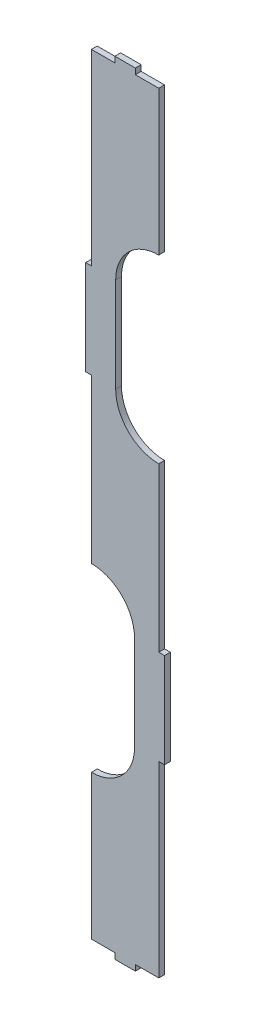
ISO-10303-21;
HEADER;
FILE_DESCRIPTION(('STEP AP214'),'2;1');
FILE_NAME('part.step','',(''),(''),'','','');
FILE_SCHEMA(('AUTOMOTIVE_DESIGN { 1 0 10303 214 1 1 1 1 }'));
ENDSEC;
DATA;
#1=APPLICATION_CONTEXT('core data for automotive mechanical design processes');
#2=APPLICATION_PROTOCOL_DEFINITION('international standard','automotive_design',2000,#1);
#3=PRODUCT_CONTEXT('',#1,'mechanical');
#4=PRODUCT('Part','Part','',(#3));
#5=PRODUCT_RELATED_PRODUCT_CATEGORY('part','',(#4));
#6=PRODUCT_DEFINITION_FORMATION('','',#4);
#7=PRODUCT_DEFINITION_CONTEXT('part definition',#1,'design');
#8=PRODUCT_DEFINITION('design','',#6,#7);
#9=PRODUCT_DEFINITION_SHAPE('','',#8);
#10=(LENGTH_UNIT() NAMED_UNIT(*) SI_UNIT(.MILLI.,.METRE.));
#11=(NAMED_UNIT(*) PLANE_ANGLE_UNIT() SI_UNIT($,.RADIAN.));
#12=(NAMED_UNIT(*) SI_UNIT($,.STERADIAN.) SOLID_ANGLE_UNIT());
#13=UNCERTAINTY_MEASURE_WITH_UNIT(LENGTH_MEASURE(1.E-05),#10,'distance_accuracy_value','');
#14=(GEOMETRIC_REPRESENTATION_CONTEXT(3) GLOBAL_UNCERTAINTY_ASSIGNED_CONTEXT((#13)) GLOBAL_UNIT_ASSIGNED_CONTEXT((#10,
#11,#12)) REPRESENTATION_CONTEXT('',''));
#15=CARTESIAN_POINT('',(0.,0.,0.));
#16=DIRECTION('',(0.,0.,1.));
#17=DIRECTION('',(1.,0.,0.));
#18=AXIS2_PLACEMENT_3D('',#15,#16,#17);
#19=CARTESIAN_POINT('',(7.60000000000003,286.,4.3));
#20=DIRECTION('',(0.,-1.,0.));
#21=DIRECTION('',(0.,0.,-1.));
#22=AXIS2_PLACEMENT_3D('',#19,#20,#21);
#23=PLANE('',#22);
#24=DIRECTION('',(-1.,0.,0.));
#25=VECTOR('',#24,1.);
#26=CARTESIAN_POINT('',(7.60000000000003,286.,0.));
#27=LINE('',#26,#25);
#28=CARTESIAN_POINT('',(25.,286.,0.));
#29=VERTEX_POINT('',#28);
#30=CARTESIAN_POINT('',(7.60000000000003,286.,0.));
#31=VERTEX_POINT('',#30);
#32=EDGE_CURVE('E252',#29,#31,#27,.T.);
#33=ORIENTED_EDGE('',*,*,#32,.T.);
#34=DIRECTION('',(0.,0.,-1.));
#35=VECTOR('',#34,1.);
#36=CARTESIAN_POINT('',(7.60000000000003,286.,4.3));
#37=LINE('',#36,#35);
#38=CARTESIAN_POINT('',(7.60000000000003,286.,4.3));
#39=VERTEX_POINT('',#38);
#40=EDGE_CURVE('E11',#39,#31,#37,.T.);
#41=ORIENTED_EDGE('',*,*,#40,.F.);
#42=DIRECTION('',(-1.,0.,0.));
#43=VECTOR('',#42,1.);
#44=CARTESIAN_POINT('',(7.60000000000003,286.,4.3));
#45=LINE('',#44,#43);
#46=CARTESIAN_POINT('',(25.,286.,4.3));
#47=VERTEX_POINT('',#46);
#48=EDGE_CURVE('E306',#47,#39,#45,.T.);
#49=ORIENTED_EDGE('',*,*,#48,.F.);
#50=DIRECTION('',(0.,0.,-1.));
#51=VECTOR('',#50,1.);
#52=CARTESIAN_POINT('',(25.,286.,4.3));
#53=LINE('',#52,#51);
#54=EDGE_CURVE('E248',#47,#29,#53,.T.);
#55=ORIENTED_EDGE('',*,*,#54,.T.);
#56=EDGE_LOOP('',(#33,#41,#49,#55));
#57=FACE_BOUND('',#56,.T.);
#58=ADVANCED_FACE('F36',(#57),#23,.F.);
#59=CARTESIAN_POINT('',(7.60000000000003,286.,4.3));
#60=DIRECTION('',(-1.,0.,0.));
#61=DIRECTION('',(0.,-1.,0.));
#62=AXIS2_PLACEMENT_3D('',#59,#60,#61);
#63=PLANE('',#62);
#64=DIRECTION('',(0.,1.,0.));
#65=VECTOR('',#64,1.);
#66=CARTESIAN_POINT('',(7.60000000000003,286.,0.));
#67=LINE('',#66,#65);
#68=CARTESIAN_POINT('',(7.59999999999997,290.3,0.));
#69=VERTEX_POINT('',#68);
#70=EDGE_CURVE('E255',#31,#69,#67,.T.);
#71=ORIENTED_EDGE('',*,*,#70,.T.);
#72=DIRECTION('',(0.,0.,-1.));
#73=VECTOR('',#72,1.);
#74=CARTESIAN_POINT('',(7.59999999999997,290.3,4.3));
#75=LINE('',#74,#73);
#76=CARTESIAN_POINT('',(7.59999999999997,290.3,4.3));
#77=VERTEX_POINT('',#76);
#78=EDGE_CURVE('E44',#77,#69,#75,.T.);
#79=ORIENTED_EDGE('',*,*,#78,.F.);
#80=DIRECTION('',(0.,1.,0.));
#81=VECTOR('',#80,1.);
#82=CARTESIAN_POINT('',(7.60000000000003,286.,4.3));
#83=LINE('',#82,#81);
#84=EDGE_CURVE('E155',#39,#77,#83,.T.);
#85=ORIENTED_EDGE('',*,*,#84,.F.);
#86=ORIENTED_EDGE('',*,*,#40,.T.);
#87=EDGE_LOOP('',(#71,#79,#85,#86));
#88=FACE_BOUND('',#87,.T.);
#89=ADVANCED_FACE('F464',(#88),#63,.F.);
#90=CARTESIAN_POINT('',(-7.60000000000003,290.3,4.3));
#91=DIRECTION('',(0.,-1.,0.));
#92=DIRECTION('',(0.,0.,-1.));
#93=AXIS2_PLACEMENT_3D('',#90,#91,#92);
#94=PLANE('',#93);
#95=DIRECTION('',(-1.,0.,0.));
#96=VECTOR('',#95,1.);
#97=CARTESIAN_POINT('',(-7.60000000000003,290.3,0.));
#98=LINE('',#97,#96);
#99=CARTESIAN_POINT('',(-7.60000000000003,290.3,0.));
#100=VERTEX_POINT('',#99);
#101=EDGE_CURVE('E257',#69,#100,#98,.T.);
#102=ORIENTED_EDGE('',*,*,#101,.T.);
#103=DIRECTION('',(0.,0.,-1.));
#104=VECTOR('',#103,1.);
#105=CARTESIAN_POINT('',(-7.60000000000003,290.3,4.3));
#106=LINE('',#105,#104);
#107=CARTESIAN_POINT('',(-7.60000000000003,290.3,4.3));
#108=VERTEX_POINT('',#107);
#109=EDGE_CURVE('E373',#108,#100,#106,.T.);
#110=ORIENTED_EDGE('',*,*,#109,.F.);
#111=DIRECTION('',(-1.,0.,0.));
#112=VECTOR('',#111,1.);
#113=CARTESIAN_POINT('',(-7.60000000000003,290.3,4.3));
#114=LINE('',#113,#112);
#115=EDGE_CURVE('E381',#77,#108,#114,.T.);
#116=ORIENTED_EDGE('',*,*,#115,.F.);
#117=ORIENTED_EDGE('',*,*,#78,.T.);
#118=EDGE_LOOP('',(#102,#110,#116,#117));
#119=FACE_BOUND('',#118,.T.);
#120=ADVANCED_FACE('F379',(#119),#94,.F.);
#121=CARTESIAN_POINT('',(-7.60000000000003,286.,4.3));
#122=DIRECTION('',(1.,0.,0.));
#123=DIRECTION('',(0.,0.,-1.));
#124=AXIS2_PLACEMENT_3D('',#121,#122,#123);
#125=PLANE('',#124);
#126=DIRECTION('',(0.,-1.,0.));
#127=VECTOR('',#126,1.);
#128=CARTESIAN_POINT('',(-7.60000000000003,286.,0.));
#129=LINE('',#128,#127);
#130=CARTESIAN_POINT('',(-7.60000000000003,286.,0.));
#131=VERTEX_POINT('',#130);
#132=EDGE_CURVE('E259',#100,#131,#129,.T.);
#133=ORIENTED_EDGE('',*,*,#132,.T.);
#134=DIRECTION('',(0.,0.,-1.));
#135=VECTOR('',#134,1.);
#136=CARTESIAN_POINT('',(-7.60000000000003,286.,4.3));
#137=LINE('',#136,#135);
#138=CARTESIAN_POINT('',(-7.60000000000003,286.,4.3));
#139=VERTEX_POINT('',#138);
#140=EDGE_CURVE('E370',#139,#131,#137,.T.);
#141=ORIENTED_EDGE('',*,*,#140,.F.);
#142=DIRECTION('',(0.,-1.,0.));
#143=VECTOR('',#142,1.);
#144=CARTESIAN_POINT('',(-7.60000000000003,286.,4.3));
#145=LINE('',#144,#143);
#146=EDGE_CURVE('E399',#108,#139,#145,.T.);
#147=ORIENTED_EDGE('',*,*,#146,.F.);
#148=ORIENTED_EDGE('',*,*,#109,.T.);
#149=EDGE_LOOP('',(#133,#141,#147,#148));
#150=FACE_BOUND('',#149,.T.);
#151=ADVANCED_FACE('F390',(#150),#125,.F.);
#152=CARTESIAN_POINT('',(-25.,286.,4.3));
#153=DIRECTION('',(0.,-1.,0.));
#154=DIRECTION('',(0.,0.,-1.));
#155=AXIS2_PLACEMENT_3D('',#152,#153,#154);
#156=PLANE('',#155);
#157=DIRECTION('',(-1.,0.,0.));
#158=VECTOR('',#157,1.);
#159=CARTESIAN_POINT('',(-25.,286.,0.));
#160=LINE('',#159,#158);
#161=CARTESIAN_POINT('',(-25.,286.,0.));
#162=VERTEX_POINT('',#161);
#163=EDGE_CURVE('E261',#131,#162,#160,.T.);
#164=ORIENTED_EDGE('',*,*,#163,.T.);
#165=DIRECTION('',(0.,0.,-1.));
#166=VECTOR('',#165,1.);
#167=CARTESIAN_POINT('',(-25.,286.,4.3));
#168=LINE('',#167,#166);
#169=CARTESIAN_POINT('',(-25.,286.,4.3));
#170=VERTEX_POINT('',#169);
#171=EDGE_CURVE('E367',#170,#162,#168,.T.);
#172=ORIENTED_EDGE('',*,*,#171,.F.);
#173=DIRECTION('',(-1.,0.,0.));
#174=VECTOR('',#173,1.);
#175=CARTESIAN_POINT('',(-25.,286.,4.3));
#176=LINE('',#175,#174);
#177=EDGE_CURVE('E396',#139,#170,#176,.T.);
#178=ORIENTED_EDGE('',*,*,#177,.F.);
#179=ORIENTED_EDGE('',*,*,#140,.T.);
#180=EDGE_LOOP('',(#164,#172,#178,#179));
#181=FACE_BOUND('',#180,.T.);
#182=ADVANCED_FACE('F394',(#181),#156,.F.);
#183=CARTESIAN_POINT('',(-25.,146.7667,4.3));
#184=DIRECTION('',(1.,0.,0.));
#185=DIRECTION('',(0.,1.,0.));
#186=AXIS2_PLACEMENT_3D('',#183,#184,#185);
#187=PLANE('',#186);
#188=DIRECTION('',(0.,-1.,0.));
#189=VECTOR('',#188,1.);
#190=CARTESIAN_POINT('',(-25.,146.7667,0.));
#191=LINE('',#190,#189);
#192=CARTESIAN_POINT('',(-25.,146.7667,0.));
#193=VERTEX_POINT('',#192);
#194=EDGE_CURVE('E263',#162,#193,#191,.T.);
#195=ORIENTED_EDGE('',*,*,#194,.T.);
#196=DIRECTION('',(0.,0.,-1.));
#197=VECTOR('',#196,1.);
#198=CARTESIAN_POINT('',(-25.,146.7667,4.3));
#199=LINE('',#198,#197);
#200=CARTESIAN_POINT('',(-25.,146.7667,4.3));
#201=VERTEX_POINT('',#200);
#202=EDGE_CURVE('E364',#201,#193,#199,.T.);
#203=ORIENTED_EDGE('',*,*,#202,.F.);
#204=DIRECTION('',(0.,-1.,0.));
#205=VECTOR('',#204,1.);
#206=CARTESIAN_POINT('',(-25.,146.7667,4.3));
#207=LINE('',#206,#205);
#208=EDGE_CURVE('E398',#170,#201,#207,.T.);
#209=ORIENTED_EDGE('',*,*,#208,.F.);
#210=ORIENTED_EDGE('',*,*,#171,.T.);
#211=EDGE_LOOP('',(#195,#203,#209,#210));
#212=FACE_BOUND('',#211,.T.);
#213=ADVANCED_FACE('F477',(#212),#187,.F.);
#214=CARTESIAN_POINT('',(-25.,146.7667,4.3));
#215=DIRECTION('',(0.,-1.,0.));
#216=DIRECTION('',(0.,0.,-1.));
#217=AXIS2_PLACEMENT_3D('',#214,#215,#216);
#218=PLANE('',#217);
#219=DIRECTION('',(-1.,0.,0.));
#220=VECTOR('',#219,1.);
#221=CARTESIAN_POINT('',(-25.,146.7667,0.));
#222=LINE('',#221,#220);
#223=CARTESIAN_POINT('',(-29.3,146.7667,0.));
#224=VERTEX_POINT('',#223);
#225=EDGE_CURVE('E265',#193,#224,#222,.T.);
#226=ORIENTED_EDGE('',*,*,#225,.T.);
#227=DIRECTION('',(0.,0.,-1.));
#228=VECTOR('',#227,1.);
#229=CARTESIAN_POINT('',(-29.3,146.7667,4.3));
#230=LINE('',#229,#228);
#231=CARTESIAN_POINT('',(-29.3,146.7667,4.3));
#232=VERTEX_POINT('',#231);
#233=EDGE_CURVE('E361',#232,#224,#230,.T.);
#234=ORIENTED_EDGE('',*,*,#233,.F.);
#235=DIRECTION('',(-1.,0.,0.));
#236=VECTOR('',#235,1.);
#237=CARTESIAN_POINT('',(-25.,146.7667,4.3));
#238=LINE('',#237,#236);
#239=EDGE_CURVE('E401',#201,#232,#238,.T.);
#240=ORIENTED_EDGE('',*,*,#239,.F.);
#241=ORIENTED_EDGE('',*,*,#202,.T.);
#242=EDGE_LOOP('',(#226,#234,#240,#241));
#243=FACE_BOUND('',#242,.T.);
#244=ADVANCED_FACE('F480',(#243),#218,.F.);
#245=CARTESIAN_POINT('',(-29.3,146.7667,4.3));
#246=DIRECTION('',(1.,0.,0.));
#247=DIRECTION('',(0.,1.,0.));
#248=AXIS2_PLACEMENT_3D('',#245,#246,#247);
#249=PLANE('',#248);
#250=DIRECTION('',(0.,-1.,0.));
#251=VECTOR('',#250,1.);
#252=CARTESIAN_POINT('',(-29.3,146.7667,0.));
#253=LINE('',#252,#251);
#254=CARTESIAN_POINT('',(-29.3,76.5666999999999,0.));
#255=VERTEX_POINT('',#254);
#256=EDGE_CURVE('E267',#224,#255,#253,.T.);
#257=ORIENTED_EDGE('',*,*,#256,.T.);
#258=DIRECTION('',(0.,0.,-1.));
#259=VECTOR('',#258,1.);
#260=CARTESIAN_POINT('',(-29.3,76.5666999999999,4.3));
#261=LINE('',#260,#259);
#262=CARTESIAN_POINT('',(-29.3,76.5666999999999,4.3));
#263=VERTEX_POINT('',#262);
#264=EDGE_CURVE('E358',#263,#255,#261,.T.);
#265=ORIENTED_EDGE('',*,*,#264,.F.);
#266=DIRECTION('',(0.,-1.,0.));
#267=VECTOR('',#266,1.);
#268=CARTESIAN_POINT('',(-29.3,146.7667,4.3));
#269=LINE('',#268,#267);
#270=EDGE_CURVE('E407',#232,#263,#269,.T.);
#271=ORIENTED_EDGE('',*,*,#270,.F.);
#272=ORIENTED_EDGE('',*,*,#233,.T.);
#273=EDGE_LOOP('',(#257,#265,#271,#272));
#274=FACE_BOUND('',#273,.T.);
#275=ADVANCED_FACE('F484',(#274),#249,.F.);
#276=CARTESIAN_POINT('',(-25.,76.5666999999999,4.3));
#277=DIRECTION('',(0.,1.,0.));
#278=DIRECTION('',(0.,0.,1.));
#279=AXIS2_PLACEMENT_3D('',#276,#277,#278);
#280=PLANE('',#279);
#281=DIRECTION('',(1.,0.,0.));
#282=VECTOR('',#281,1.);
#283=CARTESIAN_POINT('',(-25.,76.5666999999999,0.));
#284=LINE('',#283,#282);
#285=CARTESIAN_POINT('',(-25.,76.5666999999999,0.));
#286=VERTEX_POINT('',#285);
#287=EDGE_CURVE('E269',#255,#286,#284,.T.);
#288=ORIENTED_EDGE('',*,*,#287,.T.);
#289=DIRECTION('',(0.,0.,-1.));
#290=VECTOR('',#289,1.);
#291=CARTESIAN_POINT('',(-25.,76.5666999999999,4.3));
#292=LINE('',#291,#290);
#293=CARTESIAN_POINT('',(-25.,76.5666999999999,4.3));
#294=VERTEX_POINT('',#293);
#295=EDGE_CURVE('E355',#294,#286,#292,.T.);
#296=ORIENTED_EDGE('',*,*,#295,.F.);
#297=DIRECTION('',(1.,0.,0.));
#298=VECTOR('',#297,1.);
#299=CARTESIAN_POINT('',(-25.,76.5666999999999,4.3));
#300=LINE('',#299,#298);
#301=EDGE_CURVE('E409',#263,#294,#300,.T.);
#302=ORIENTED_EDGE('',*,*,#301,.F.);
#303=ORIENTED_EDGE('',*,*,#264,.T.);
#304=EDGE_LOOP('',(#288,#296,#302,#303));
#305=FACE_BOUND('',#304,.T.);
#306=ADVANCED_FACE('F488',(#305),#280,.F.);
#307=CARTESIAN_POINT('',(-25.,-44.5666000000001,4.3));
#308=DIRECTION('',(1.,0.,0.));
#309=DIRECTION('',(0.,1.,0.));
#310=AXIS2_PLACEMENT_3D('',#307,#308,#309);
#311=PLANE('',#310);
#312=DIRECTION('',(0.,-1.,0.));
#313=VECTOR('',#312,1.);
#314=CARTESIAN_POINT('',(-25.,-44.5666000000001,0.));
#315=LINE('',#314,#313);
#316=CARTESIAN_POINT('',(-25.,-44.5666000000001,0.));
#317=VERTEX_POINT('',#316);
#318=EDGE_CURVE('E271',#286,#317,#315,.T.);
#319=ORIENTED_EDGE('',*,*,#318,.T.);
#320=DIRECTION('',(0.,0.,-1.));
#321=VECTOR('',#320,1.);
#322=CARTESIAN_POINT('',(-25.,-44.5666000000001,4.3));
#323=LINE('',#322,#321);
#324=CARTESIAN_POINT('',(-25.,-44.5666000000001,4.3));
#325=VERTEX_POINT('',#324);
#326=EDGE_CURVE('E352',#325,#317,#323,.T.);
#327=ORIENTED_EDGE('',*,*,#326,.F.);
#328=DIRECTION('',(0.,-1.,0.));
#329=VECTOR('',#328,1.);
#330=CARTESIAN_POINT('',(-25.,-44.5666000000001,4.3));
#331=LINE('',#330,#329);
#332=EDGE_CURVE('E411',#294,#325,#331,.T.);
#333=ORIENTED_EDGE('',*,*,#332,.F.);
#334=ORIENTED_EDGE('',*,*,#295,.T.);
#335=EDGE_LOOP('',(#319,#327,#333,#334));
#336=FACE_BOUND('',#335,.T.);
#337=ADVANCED_FACE('F492',(#336),#311,.F.);
#338=CARTESIAN_POINT('',(-25.,-76.5666000000001,4.3));
#339=DIRECTION('',(0.,0.,-1.));
#340=DIRECTION('',(-1.,0.,0.));
#341=AXIS2_PLACEMENT_3D('',#338,#339,#340);
#342=CYLINDRICAL_SURFACE('',#341,32.);
#343=CARTESIAN_POINT('',(-25.,-76.5666000000001,0.));
#344=DIRECTION('',(0.,0.,-1.));
#345=DIRECTION('',(1.,0.,0.));
#346=AXIS2_PLACEMENT_3D('',#343,#344,#345);
#347=CIRCLE('',#346,32.);
#348=CARTESIAN_POINT('',(6.99999999999997,-76.5666000000001,0.));
#349=VERTEX_POINT('',#348);
#350=EDGE_CURVE('E273',#317,#349,#347,.T.);
#351=ORIENTED_EDGE('',*,*,#350,.T.);
#352=DIRECTION('',(0.,0.,-1.));
#353=VECTOR('',#352,1.);
#354=CARTESIAN_POINT('',(6.99999999999997,-76.5666000000001,4.3));
#355=LINE('',#354,#353);
#356=CARTESIAN_POINT('',(6.99999999999997,-76.5666000000001,4.3));
#357=VERTEX_POINT('',#356);
#358=EDGE_CURVE('E349',#357,#349,#355,.T.);
#359=ORIENTED_EDGE('',*,*,#358,.F.);
#360=CARTESIAN_POINT('',(-25.,-76.5666000000001,4.3));
#361=DIRECTION('',(0.,0.,-1.));
#362=DIRECTION('',(1.,0.,0.));
#363=AXIS2_PLACEMENT_3D('',#360,#361,#362);
#364=CIRCLE('',#363,32.);
#365=EDGE_CURVE('E413',#325,#357,#364,.T.);
#366=ORIENTED_EDGE('',*,*,#365,.F.);
#367=ORIENTED_EDGE('',*,*,#326,.T.);
#368=EDGE_LOOP('',(#351,#359,#366,#367));
#369=FACE_BOUND('',#368,.T.);
#370=ADVANCED_FACE('F496',(#369),#342,.F.);
#371=CARTESIAN_POINT('',(6.99999999999997,-146.7666,4.3));
#372=DIRECTION('',(1.,0.,0.));
#373=DIRECTION('',(0.,1.,0.));
#374=AXIS2_PLACEMENT_3D('',#371,#372,#373);
#375=PLANE('',#374);
#376=DIRECTION('',(0.,-1.,0.));
#377=VECTOR('',#376,1.);
#378=CARTESIAN_POINT('',(6.99999999999997,-146.7666,0.));
#379=LINE('',#378,#377);
#380=CARTESIAN_POINT('',(6.99999999999997,-146.7666,0.));
#381=VERTEX_POINT('',#380);
#382=EDGE_CURVE('E275',#349,#381,#379,.T.);
#383=ORIENTED_EDGE('',*,*,#382,.T.);
#384=DIRECTION('',(0.,0.,-1.));
#385=VECTOR('',#384,1.);
#386=CARTESIAN_POINT('',(6.99999999999997,-146.7666,4.3));
#387=LINE('',#386,#385);
#388=CARTESIAN_POINT('',(6.99999999999997,-146.7666,4.3));
#389=VERTEX_POINT('',#388);
#390=EDGE_CURVE('E346',#389,#381,#387,.T.);
#391=ORIENTED_EDGE('',*,*,#390,.F.);
#392=DIRECTION('',(0.,-1.,0.));
#393=VECTOR('',#392,1.);
#394=CARTESIAN_POINT('',(6.99999999999997,-146.7666,4.3));
#395=LINE('',#394,#393);
#396=EDGE_CURVE('E415',#357,#389,#395,.T.);
#397=ORIENTED_EDGE('',*,*,#396,.F.);
#398=ORIENTED_EDGE('',*,*,#358,.T.);
#399=EDGE_LOOP('',(#383,#391,#397,#398));
#400=FACE_BOUND('',#399,.T.);
#401=ADVANCED_FACE('F500',(#400),#375,.F.);
#402=CARTESIAN_POINT('',(-25.,-146.7666,4.3));
#403=DIRECTION('',(0.,0.,-1.));
#404=DIRECTION('',(-1.,0.,0.));
#405=AXIS2_PLACEMENT_3D('',#402,#403,#404);
#406=CYLINDRICAL_SURFACE('',#405,32.);
#407=CARTESIAN_POINT('',(-25.,-146.7666,0.));
#408=DIRECTION('',(0.,0.,-1.));
#409=DIRECTION('',(1.,0.,0.));
#410=AXIS2_PLACEMENT_3D('',#407,#408,#409);
#411=CIRCLE('',#410,32.);
#412=CARTESIAN_POINT('',(-25.,-178.7666,0.));
#413=VERTEX_POINT('',#412);
#414=EDGE_CURVE('E277',#381,#413,#411,.T.);
#415=ORIENTED_EDGE('',*,*,#414,.T.);
#416=DIRECTION('',(0.,0.,-1.));
#417=VECTOR('',#416,1.);
#418=CARTESIAN_POINT('',(-25.,-178.7666,4.3));
#419=LINE('',#418,#417);
#420=CARTESIAN_POINT('',(-25.,-178.7666,4.3));
#421=VERTEX_POINT('',#420);
#422=EDGE_CURVE('E343',#421,#413,#419,.T.);
#423=ORIENTED_EDGE('',*,*,#422,.F.);
#424=CARTESIAN_POINT('',(-25.,-146.7666,4.3));
#425=DIRECTION('',(0.,0.,-1.));
#426=DIRECTION('',(1.,0.,0.));
#427=AXIS2_PLACEMENT_3D('',#424,#425,#426);
#428=CIRCLE('',#427,32.);
#429=EDGE_CURVE('E417',#389,#421,#428,.T.);
#430=ORIENTED_EDGE('',*,*,#429,.F.);
#431=ORIENTED_EDGE('',*,*,#390,.T.);
#432=EDGE_LOOP('',(#415,#423,#430,#431));
#433=FACE_BOUND('',#432,.T.);
#434=ADVANCED_FACE('F504',(#433),#406,.F.);
#435=CARTESIAN_POINT('',(-25.,-286.,4.3));
#436=DIRECTION('',(1.,0.,0.));
#437=DIRECTION('',(0.,1.,0.));
#438=AXIS2_PLACEMENT_3D('',#435,#436,#437);
#439=PLANE('',#438);
#440=DIRECTION('',(0.,-1.,0.));
#441=VECTOR('',#440,1.);
#442=CARTESIAN_POINT('',(-25.,-286.,0.));
#443=LINE('',#442,#441);
#444=CARTESIAN_POINT('',(-25.,-286.,0.));
#445=VERTEX_POINT('',#444);
#446=EDGE_CURVE('E279',#413,#445,#443,.T.);
#447=ORIENTED_EDGE('',*,*,#446,.T.);
#448=DIRECTION('',(0.,0.,-1.));
#449=VECTOR('',#448,1.);
#450=CARTESIAN_POINT('',(-25.,-286.,4.3));
#451=LINE('',#450,#449);
#452=CARTESIAN_POINT('',(-25.,-286.,4.3));
#453=VERTEX_POINT('',#452);
#454=EDGE_CURVE('E340',#453,#445,#451,.T.);
#455=ORIENTED_EDGE('',*,*,#454,.F.);
#456=DIRECTION('',(0.,-1.,0.));
#457=VECTOR('',#456,1.);
#458=CARTESIAN_POINT('',(-25.,-286.,4.3));
#459=LINE('',#458,#457);
#460=EDGE_CURVE('E419',#421,#453,#459,.T.);
#461=ORIENTED_EDGE('',*,*,#460,.F.);
#462=ORIENTED_EDGE('',*,*,#422,.T.);
#463=EDGE_LOOP('',(#447,#455,#461,#462));
#464=FACE_BOUND('',#463,.T.);
#465=ADVANCED_FACE('F508',(#464),#439,.F.);
#466=CARTESIAN_POINT('',(-25.,-286.,4.3));
#467=DIRECTION('',(0.,1.,0.));
#468=DIRECTION('',(0.,0.,1.));
#469=AXIS2_PLACEMENT_3D('',#466,#467,#468);
#470=PLANE('',#469);
#471=DIRECTION('',(1.,0.,0.));
#472=VECTOR('',#471,1.);
#473=CARTESIAN_POINT('',(-25.,-286.,0.));
#474=LINE('',#473,#472);
#475=CARTESIAN_POINT('',(-7.59999999999987,-286.,0.));
#476=VERTEX_POINT('',#475);
#477=EDGE_CURVE('E281',#445,#476,#474,.T.);
#478=ORIENTED_EDGE('',*,*,#477,.T.);
#479=DIRECTION('',(0.,0.,-1.));
#480=VECTOR('',#479,1.);
#481=CARTESIAN_POINT('',(-7.59999999999987,-286.,4.3));
#482=LINE('',#481,#480);
#483=CARTESIAN_POINT('',(-7.59999999999987,-286.,4.3));
#484=VERTEX_POINT('',#483);
#485=EDGE_CURVE('E337',#484,#476,#482,.T.);
#486=ORIENTED_EDGE('',*,*,#485,.F.);
#487=DIRECTION('',(1.,0.,0.));
#488=VECTOR('',#487,1.);
#489=CARTESIAN_POINT('',(-25.,-286.,4.3));
#490=LINE('',#489,#488);
#491=EDGE_CURVE('E421',#453,#484,#490,.T.);
#492=ORIENTED_EDGE('',*,*,#491,.F.);
#493=ORIENTED_EDGE('',*,*,#454,.T.);
#494=EDGE_LOOP('',(#478,#486,#492,#493));
#495=FACE_BOUND('',#494,.T.);
#496=ADVANCED_FACE('F512',(#495),#470,.F.);
#497=CARTESIAN_POINT('',(-7.59999999999987,-286.,4.3));
#498=DIRECTION('',(1.,0.,0.));
#499=DIRECTION('',(0.,1.,0.));
#500=AXIS2_PLACEMENT_3D('',#497,#498,#499);
#501=PLANE('',#500);
#502=DIRECTION('',(0.,-1.,0.));
#503=VECTOR('',#502,1.);
#504=CARTESIAN_POINT('',(-7.59999999999987,-286.,0.));
#505=LINE('',#504,#503);
#506=CARTESIAN_POINT('',(-7.60000000000003,-290.3,0.));
#507=VERTEX_POINT('',#506);
#508=EDGE_CURVE('E283',#476,#507,#505,.T.);
#509=ORIENTED_EDGE('',*,*,#508,.T.);
#510=DIRECTION('',(0.,0.,-1.));
#511=VECTOR('',#510,1.);
#512=CARTESIAN_POINT('',(-7.60000000000003,-290.3,4.3));
#513=LINE('',#512,#511);
#514=CARTESIAN_POINT('',(-7.60000000000003,-290.3,4.3));
#515=VERTEX_POINT('',#514);
#516=EDGE_CURVE('E334',#515,#507,#513,.T.);
#517=ORIENTED_EDGE('',*,*,#516,.F.);
#518=DIRECTION('',(0.,-1.,0.));
#519=VECTOR('',#518,1.);
#520=CARTESIAN_POINT('',(-7.59999999999987,-286.,4.3));
#521=LINE('',#520,#519);
#522=EDGE_CURVE('E423',#484,#515,#521,.T.);
#523=ORIENTED_EDGE('',*,*,#522,.F.);
#524=ORIENTED_EDGE('',*,*,#485,.T.);
#525=EDGE_LOOP('',(#509,#517,#523,#524));
#526=FACE_BOUND('',#525,.T.);
#527=ADVANCED_FACE('F516',(#526),#501,.F.);
#528=CARTESIAN_POINT('',(-7.60000000000003,-290.3,4.3));
#529=DIRECTION('',(0.,1.,0.));
#530=DIRECTION('',(0.,0.,1.));
#531=AXIS2_PLACEMENT_3D('',#528,#529,#530);
#532=PLANE('',#531);
#533=DIRECTION('',(1.,0.,0.));
#534=VECTOR('',#533,1.);
#535=CARTESIAN_POINT('',(-7.60000000000003,-290.3,0.));
#536=LINE('',#535,#534);
#537=CARTESIAN_POINT('',(7.59999999999997,-290.3,0.));
#538=VERTEX_POINT('',#537);
#539=EDGE_CURVE('E285',#507,#538,#536,.T.);
#540=ORIENTED_EDGE('',*,*,#539,.T.);
#541=DIRECTION('',(0.,0.,-1.));
#542=VECTOR('',#541,1.);
#543=CARTESIAN_POINT('',(7.59999999999997,-290.3,4.3));
#544=LINE('',#543,#542);
#545=CARTESIAN_POINT('',(7.59999999999997,-290.3,4.3));
#546=VERTEX_POINT('',#545);
#547=EDGE_CURVE('E331',#546,#538,#544,.T.);
#548=ORIENTED_EDGE('',*,*,#547,.F.);
#549=DIRECTION('',(1.,0.,0.));
#550=VECTOR('',#549,1.);
#551=CARTESIAN_POINT('',(-7.60000000000003,-290.3,4.3));
#552=LINE('',#551,#550);
#553=EDGE_CURVE('E425',#515,#546,#552,.T.);
#554=ORIENTED_EDGE('',*,*,#553,.F.);
#555=ORIENTED_EDGE('',*,*,#516,.T.);
#556=EDGE_LOOP('',(#540,#548,#554,#555));
#557=FACE_BOUND('',#556,.T.);
#558=ADVANCED_FACE('F520',(#557),#532,.F.);
#559=CARTESIAN_POINT('',(7.59999999999997,-286.,4.3));
#560=DIRECTION('',(-1.,0.,0.));
#561=DIRECTION('',(0.,0.,1.));
#562=AXIS2_PLACEMENT_3D('',#559,#560,#561);
#563=PLANE('',#562);
#564=DIRECTION('',(0.,1.,0.));
#565=VECTOR('',#564,1.);
#566=CARTESIAN_POINT('',(7.59999999999997,-286.,0.));
#567=LINE('',#566,#565);
#568=CARTESIAN_POINT('',(7.59999999999997,-286.,0.));
#569=VERTEX_POINT('',#568);
#570=EDGE_CURVE('E287',#538,#569,#567,.T.);
#571=ORIENTED_EDGE('',*,*,#570,.T.);
#572=DIRECTION('',(0.,0.,-1.));
#573=VECTOR('',#572,1.);
#574=CARTESIAN_POINT('',(7.59999999999997,-286.,4.3));
#575=LINE('',#574,#573);
#576=CARTESIAN_POINT('',(7.59999999999997,-286.,4.3));
#577=VERTEX_POINT('',#576);
#578=EDGE_CURVE('E328',#577,#569,#575,.T.);
#579=ORIENTED_EDGE('',*,*,#578,.F.);
#580=DIRECTION('',(0.,1.,0.));
#581=VECTOR('',#580,1.);
#582=CARTESIAN_POINT('',(7.59999999999997,-286.,4.3));
#583=LINE('',#582,#581);
#584=EDGE_CURVE('E427',#546,#577,#583,.T.);
#585=ORIENTED_EDGE('',*,*,#584,.F.);
#586=ORIENTED_EDGE('',*,*,#547,.T.);
#587=EDGE_LOOP('',(#571,#579,#585,#586));
#588=FACE_BOUND('',#587,.T.);
#589=ADVANCED_FACE('F524',(#588),#563,.F.);
#590=CARTESIAN_POINT('',(7.59999999999997,-286.,4.3));
#591=DIRECTION('',(0.,1.,0.));
#592=DIRECTION('',(0.,0.,1.));
#593=AXIS2_PLACEMENT_3D('',#590,#591,#592);
#594=PLANE('',#593);
#595=DIRECTION('',(1.,0.,0.));
#596=VECTOR('',#595,1.);
#597=CARTESIAN_POINT('',(7.59999999999997,-286.,0.));
#598=LINE('',#597,#596);
#599=CARTESIAN_POINT('',(25.,-286.,0.));
#600=VERTEX_POINT('',#599);
#601=EDGE_CURVE('E289',#569,#600,#598,.T.);
#602=ORIENTED_EDGE('',*,*,#601,.T.);
#603=DIRECTION('',(0.,0.,-1.));
#604=VECTOR('',#603,1.);
#605=CARTESIAN_POINT('',(25.,-286.,4.3));
#606=LINE('',#605,#604);
#607=CARTESIAN_POINT('',(25.,-286.,4.3));
#608=VERTEX_POINT('',#607);
#609=EDGE_CURVE('E325',#608,#600,#606,.T.);
#610=ORIENTED_EDGE('',*,*,#609,.F.);
#611=DIRECTION('',(1.,0.,0.));
#612=VECTOR('',#611,1.);
#613=CARTESIAN_POINT('',(7.59999999999997,-286.,4.3));
#614=LINE('',#613,#612);
#615=EDGE_CURVE('E429',#577,#608,#614,.T.);
#616=ORIENTED_EDGE('',*,*,#615,.F.);
#617=ORIENTED_EDGE('',*,*,#578,.T.);
#618=EDGE_LOOP('',(#602,#610,#616,#617));
#619=FACE_BOUND('',#618,.T.);
#620=ADVANCED_FACE('F528',(#619),#594,.F.);
#621=CARTESIAN_POINT('',(25.,-286.,4.3));
#622=DIRECTION('',(-1.,0.,0.));
#623=DIRECTION('',(0.,-1.,0.));
#624=AXIS2_PLACEMENT_3D('',#621,#622,#623);
#625=PLANE('',#624);
#626=DIRECTION('',(0.,1.,0.));
#627=VECTOR('',#626,1.);
#628=CARTESIAN_POINT('',(25.,-286.,0.));
#629=LINE('',#628,#627);
#630=CARTESIAN_POINT('',(25.,-146.7666,0.));
#631=VERTEX_POINT('',#630);
#632=EDGE_CURVE('E291',#600,#631,#629,.T.);
#633=ORIENTED_EDGE('',*,*,#632,.T.);
#634=DIRECTION('',(0.,0.,-1.));
#635=VECTOR('',#634,1.);
#636=CARTESIAN_POINT('',(25.,-146.7666,4.3));
#637=LINE('',#636,#635);
#638=CARTESIAN_POINT('',(25.,-146.7666,4.3));
#639=VERTEX_POINT('',#638);
#640=EDGE_CURVE('E322',#639,#631,#637,.T.);
#641=ORIENTED_EDGE('',*,*,#640,.F.);
#642=DIRECTION('',(0.,1.,0.));
#643=VECTOR('',#642,1.);
#644=CARTESIAN_POINT('',(25.,-286.,4.3));
#645=LINE('',#644,#643);
#646=EDGE_CURVE('E431',#608,#639,#645,.T.);
#647=ORIENTED_EDGE('',*,*,#646,.F.);
#648=ORIENTED_EDGE('',*,*,#609,.T.);
#649=EDGE_LOOP('',(#633,#641,#647,#648));
#650=FACE_BOUND('',#649,.T.);
#651=ADVANCED_FACE('F532',(#650),#625,.F.);
#652=CARTESIAN_POINT('',(25.,-146.7666,4.3));
#653=DIRECTION('',(0.,1.,0.));
#654=DIRECTION('',(0.,0.,1.));
#655=AXIS2_PLACEMENT_3D('',#652,#653,#654);
#656=PLANE('',#655);
#657=DIRECTION('',(1.,0.,0.));
#658=VECTOR('',#657,1.);
#659=CARTESIAN_POINT('',(25.,-146.7666,0.));
#660=LINE('',#659,#658);
#661=CARTESIAN_POINT('',(29.3,-146.7666,0.));
#662=VERTEX_POINT('',#661);
#663=EDGE_CURVE('E293',#631,#662,#660,.T.);
#664=ORIENTED_EDGE('',*,*,#663,.T.);
#665=DIRECTION('',(0.,0.,-1.));
#666=VECTOR('',#665,1.);
#667=CARTESIAN_POINT('',(29.3,-146.7666,4.3));
#668=LINE('',#667,#666);
#669=CARTESIAN_POINT('',(29.3,-146.7666,4.3));
#670=VERTEX_POINT('',#669);
#671=EDGE_CURVE('E319',#670,#662,#668,.T.);
#672=ORIENTED_EDGE('',*,*,#671,.F.);
#673=DIRECTION('',(1.,0.,0.));
#674=VECTOR('',#673,1.);
#675=CARTESIAN_POINT('',(25.,-146.7666,4.3));
#676=LINE('',#675,#674);
#677=EDGE_CURVE('E433',#639,#670,#676,.T.);
#678=ORIENTED_EDGE('',*,*,#677,.F.);
#679=ORIENTED_EDGE('',*,*,#640,.T.);
#680=EDGE_LOOP('',(#664,#672,#678,#679));
#681=FACE_BOUND('',#680,.T.);
#682=ADVANCED_FACE('F536',(#681),#656,.F.);
#683=CARTESIAN_POINT('',(29.3000000000001,-76.5666000000001,4.3));
#684=DIRECTION('',(-1.,0.,0.));
#685=DIRECTION('',(0.,-1.,0.));
#686=AXIS2_PLACEMENT_3D('',#683,#684,#685);
#687=PLANE('',#686);
#688=DIRECTION('',(0.,1.,0.));
#689=VECTOR('',#688,1.);
#690=CARTESIAN_POINT('',(29.3000000000001,-76.5666000000001,0.));
#691=LINE('',#690,#689);
#692=CARTESIAN_POINT('',(29.3000000000001,-76.5666000000001,0.));
#693=VERTEX_POINT('',#692);
#694=EDGE_CURVE('E295',#662,#693,#691,.T.);
#695=ORIENTED_EDGE('',*,*,#694,.T.);
#696=DIRECTION('',(0.,0.,-1.));
#697=VECTOR('',#696,1.);
#698=CARTESIAN_POINT('',(29.3000000000001,-76.5666000000001,4.3));
#699=LINE('',#698,#697);
#700=CARTESIAN_POINT('',(29.3000000000001,-76.5666000000001,4.3));
#701=VERTEX_POINT('',#700);
#702=EDGE_CURVE('E316',#701,#693,#699,.T.);
#703=ORIENTED_EDGE('',*,*,#702,.F.);
#704=DIRECTION('',(0.,1.,0.));
#705=VECTOR('',#704,1.);
#706=CARTESIAN_POINT('',(29.3000000000001,-76.5666000000001,4.3));
#707=LINE('',#706,#705);
#708=EDGE_CURVE('E435',#670,#701,#707,.T.);
#709=ORIENTED_EDGE('',*,*,#708,.F.);
#710=ORIENTED_EDGE('',*,*,#671,.T.);
#711=EDGE_LOOP('',(#695,#703,#709,#710));
#712=FACE_BOUND('',#711,.T.);
#713=ADVANCED_FACE('F540',(#712),#687,.F.);
#714=CARTESIAN_POINT('',(25.,-76.5666000000001,4.3));
#715=DIRECTION('',(0.,-1.,0.));
#716=DIRECTION('',(1.,0.,0.));
#717=AXIS2_PLACEMENT_3D('',#714,#715,#716);
#718=PLANE('',#717);
#719=DIRECTION('',(-1.,0.,0.));
#720=VECTOR('',#719,1.);
#721=CARTESIAN_POINT('',(25.,-76.5666000000001,0.));
#722=LINE('',#721,#720);
#723=CARTESIAN_POINT('',(25.,-76.5666000000001,0.));
#724=VERTEX_POINT('',#723);
#725=EDGE_CURVE('E297',#693,#724,#722,.T.);
#726=ORIENTED_EDGE('',*,*,#725,.T.);
#727=DIRECTION('',(0.,0.,-1.));
#728=VECTOR('',#727,1.);
#729=CARTESIAN_POINT('',(25.,-76.5666000000001,4.3));
#730=LINE('',#729,#728);
#731=CARTESIAN_POINT('',(25.,-76.5666000000001,4.3));
#732=VERTEX_POINT('',#731);
#733=EDGE_CURVE('E313',#732,#724,#730,.T.);
#734=ORIENTED_EDGE('',*,*,#733,.F.);
#735=DIRECTION('',(-1.,0.,0.));
#736=VECTOR('',#735,1.);
#737=CARTESIAN_POINT('',(25.,-76.5666000000001,4.3));
#738=LINE('',#737,#736);
#739=EDGE_CURVE('E437',#701,#732,#738,.T.);
#740=ORIENTED_EDGE('',*,*,#739,.F.);
#741=ORIENTED_EDGE('',*,*,#702,.T.);
#742=EDGE_LOOP('',(#726,#734,#740,#741));
#743=FACE_BOUND('',#742,.T.);
#744=ADVANCED_FACE('F544',(#743),#718,.F.);
#745=CARTESIAN_POINT('',(25.,-76.5666000000001,4.3));
#746=DIRECTION('',(-1.,0.,0.));
#747=DIRECTION('',(0.,-1.,0.));
#748=AXIS2_PLACEMENT_3D('',#745,#746,#747);
#749=PLANE('',#748);
#750=DIRECTION('',(0.,1.,0.));
#751=VECTOR('',#750,1.);
#752=CARTESIAN_POINT('',(25.,-76.5666000000001,0.));
#753=LINE('',#752,#751);
#754=CARTESIAN_POINT('',(25.,44.5666999999997,0.));
#755=VERTEX_POINT('',#754);
#756=EDGE_CURVE('E299',#724,#755,#753,.T.);
#757=ORIENTED_EDGE('',*,*,#756,.T.);
#758=DIRECTION('',(0.,0.,-1.));
#759=VECTOR('',#758,1.);
#760=CARTESIAN_POINT('',(25.,44.5666999999997,4.3));
#761=LINE('',#760,#759);
#762=CARTESIAN_POINT('',(25.,44.5666999999997,4.3));
#763=VERTEX_POINT('',#762);
#764=EDGE_CURVE('E310',#763,#755,#761,.T.);
#765=ORIENTED_EDGE('',*,*,#764,.F.);
#766=DIRECTION('',(0.,1.,0.));
#767=VECTOR('',#766,1.);
#768=CARTESIAN_POINT('',(25.,-76.5666000000001,4.3));
#769=LINE('',#768,#767);
#770=EDGE_CURVE('E439',#732,#763,#769,.T.);
#771=ORIENTED_EDGE('',*,*,#770,.F.);
#772=ORIENTED_EDGE('',*,*,#733,.T.);
#773=EDGE_LOOP('',(#757,#765,#771,#772));
#774=FACE_BOUND('',#773,.T.);
#775=ADVANCED_FACE('F445',(#774),#749,.F.);
#776=CARTESIAN_POINT('',(25.0000000000001,76.5666999999999,4.3));
#777=DIRECTION('',(0.,0.,-1.));
#778=DIRECTION('',(-1.,0.,0.));
#779=AXIS2_PLACEMENT_3D('',#776,#777,#778);
#780=CYLINDRICAL_SURFACE('',#779,32.0000000000001);
#781=CARTESIAN_POINT('',(25.0000000000001,76.5666999999999,0.));
#782=DIRECTION('',(0.,0.,-1.));
#783=DIRECTION('',(1.,0.,0.));
#784=AXIS2_PLACEMENT_3D('',#781,#782,#783);
#785=CIRCLE('',#784,32.0000000000001);
#786=CARTESIAN_POINT('',(-7.00000000000004,76.5666999999999,0.));
#787=VERTEX_POINT('',#786);
#788=EDGE_CURVE('E301',#755,#787,#785,.T.);
#789=ORIENTED_EDGE('',*,*,#788,.T.);
#790=DIRECTION('',(0.,0.,-1.));
#791=VECTOR('',#790,1.);
#792=CARTESIAN_POINT('',(-7.00000000000004,76.5666999999999,4.3));
#793=LINE('',#792,#791);
#794=CARTESIAN_POINT('',(-7.00000000000004,76.5666999999999,4.3));
#795=VERTEX_POINT('',#794);
#796=EDGE_CURVE('E243',#795,#787,#793,.T.);
#797=ORIENTED_EDGE('',*,*,#796,.F.);
#798=CARTESIAN_POINT('',(25.0000000000001,76.5666999999999,4.3));
#799=DIRECTION('',(0.,0.,-1.));
#800=DIRECTION('',(1.,0.,0.));
#801=AXIS2_PLACEMENT_3D('',#798,#799,#800);
#802=CIRCLE('',#801,32.0000000000001);
#803=EDGE_CURVE('E234',#763,#795,#802,.T.);
#804=ORIENTED_EDGE('',*,*,#803,.F.);
#805=ORIENTED_EDGE('',*,*,#764,.T.);
#806=EDGE_LOOP('',(#789,#797,#804,#805));
#807=FACE_BOUND('',#806,.T.);
#808=ADVANCED_FACE('F449',(#807),#780,.F.);
#809=CARTESIAN_POINT('',(-7.00000000000004,76.5666999999999,4.3));
#810=DIRECTION('',(-1.,0.,0.));
#811=DIRECTION('',(0.,0.,1.));
#812=AXIS2_PLACEMENT_3D('',#809,#810,#811);
#813=PLANE('',#812);
#814=DIRECTION('',(0.,1.,0.));
#815=VECTOR('',#814,1.);
#816=CARTESIAN_POINT('',(-7.00000000000004,76.5666999999999,0.));
#817=LINE('',#816,#815);
#818=CARTESIAN_POINT('',(-7.00000000000005,146.7667,0.));
#819=VERTEX_POINT('',#818);
#820=EDGE_CURVE('E242',#787,#819,#817,.T.);
#821=ORIENTED_EDGE('',*,*,#820,.T.);
#822=DIRECTION('',(0.,0.,-1.));
#823=VECTOR('',#822,1.);
#824=CARTESIAN_POINT('',(-7.00000000000005,146.7667,4.3));
#825=LINE('',#824,#823);
#826=CARTESIAN_POINT('',(-7.00000000000005,146.7667,4.3));
#827=VERTEX_POINT('',#826);
#828=EDGE_CURVE('E239',#827,#819,#825,.T.);
#829=ORIENTED_EDGE('',*,*,#828,.F.);
#830=DIRECTION('',(0.,1.,0.));
#831=VECTOR('',#830,1.);
#832=CARTESIAN_POINT('',(-7.00000000000004,76.5666999999999,4.3));
#833=LINE('',#832,#831);
#834=EDGE_CURVE('E228',#795,#827,#833,.T.);
#835=ORIENTED_EDGE('',*,*,#834,.F.);
#836=ORIENTED_EDGE('',*,*,#796,.T.);
#837=EDGE_LOOP('',(#821,#829,#835,#836));
#838=FACE_BOUND('',#837,.T.);
#839=ADVANCED_FACE('F240',(#838),#813,.F.);
#840=CARTESIAN_POINT('',(25.0000000000001,146.7667,4.3));
#841=DIRECTION('',(0.,0.,-1.));
#842=DIRECTION('',(-1.,0.,0.));
#843=AXIS2_PLACEMENT_3D('',#840,#841,#842);
#844=CYLINDRICAL_SURFACE('',#843,32.0000000000001);
#845=CARTESIAN_POINT('',(25.0000000000001,146.7667,0.));
#846=DIRECTION('',(0.,0.,-1.));
#847=DIRECTION('',(1.,0.,0.));
#848=AXIS2_PLACEMENT_3D('',#845,#846,#847);
#849=CIRCLE('',#848,32.0000000000001);
#850=CARTESIAN_POINT('',(25.,178.7667,0.));
#851=VERTEX_POINT('',#850);
#852=EDGE_CURVE('E141',#819,#851,#849,.T.);
#853=ORIENTED_EDGE('',*,*,#852,.T.);
#854=DIRECTION('',(0.,0.,-1.));
#855=VECTOR('',#854,1.);
#856=CARTESIAN_POINT('',(25.,178.7667,4.3));
#857=LINE('',#856,#855);
#858=CARTESIAN_POINT('',(25.,178.7667,4.3));
#859=VERTEX_POINT('',#858);
#860=EDGE_CURVE('E244',#859,#851,#857,.T.);
#861=ORIENTED_EDGE('',*,*,#860,.F.);
#862=CARTESIAN_POINT('',(25.0000000000001,146.7667,4.3));
#863=DIRECTION('',(0.,0.,-1.));
#864=DIRECTION('',(1.,0.,0.));
#865=AXIS2_PLACEMENT_3D('',#862,#863,#864);
#866=CIRCLE('',#865,32.0000000000001);
#867=EDGE_CURVE('E232',#827,#859,#866,.T.);
#868=ORIENTED_EDGE('',*,*,#867,.F.);
#869=ORIENTED_EDGE('',*,*,#828,.T.);
#870=EDGE_LOOP('',(#853,#861,#868,#869));
#871=FACE_BOUND('',#870,.T.);
#872=ADVANCED_FACE('F246',(#871),#844,.F.);
#873=CARTESIAN_POINT('',(25.,178.7667,4.3));
#874=DIRECTION('',(-1.,0.,0.));
#875=DIRECTION('',(0.,-1.,0.));
#876=AXIS2_PLACEMENT_3D('',#873,#874,#875);
#877=PLANE('',#876);
#878=DIRECTION('',(0.,1.,0.));
#879=VECTOR('',#878,1.);
#880=CARTESIAN_POINT('',(25.,178.7667,0.));
#881=LINE('',#880,#879);
#882=EDGE_CURVE('E147',#851,#29,#881,.T.);
#883=ORIENTED_EDGE('',*,*,#882,.T.);
#884=ORIENTED_EDGE('',*,*,#54,.F.);
#885=DIRECTION('',(0.,1.,0.));
#886=VECTOR('',#885,1.);
#887=CARTESIAN_POINT('',(25.,178.7667,4.3));
#888=LINE('',#887,#886);
#889=EDGE_CURVE('E52',#859,#47,#888,.T.);
#890=ORIENTED_EDGE('',*,*,#889,.F.);
#891=ORIENTED_EDGE('',*,*,#860,.T.);
#892=EDGE_LOOP('',(#883,#884,#890,#891));
#893=FACE_BOUND('',#892,.T.);
#894=ADVANCED_FACE('F453',(#893),#877,.F.);
#895=CARTESIAN_POINT('',(25.0000000000001,146.7667,4.3));
#896=DIRECTION('',(0.,0.,1.));
#897=DIRECTION('',(1.,0.,0.));
#898=AXIS2_PLACEMENT_3D('',#895,#896,#897);
#899=PLANE('',#898);
#900=ORIENTED_EDGE('',*,*,#48,.T.);
#901=ORIENTED_EDGE('',*,*,#84,.T.);
#902=ORIENTED_EDGE('',*,*,#115,.T.);
#903=ORIENTED_EDGE('',*,*,#146,.T.);
#904=ORIENTED_EDGE('',*,*,#177,.T.);
#905=ORIENTED_EDGE('',*,*,#208,.T.);
#906=ORIENTED_EDGE('',*,*,#239,.T.);
#907=ORIENTED_EDGE('',*,*,#270,.T.);
#908=ORIENTED_EDGE('',*,*,#301,.T.);
#909=ORIENTED_EDGE('',*,*,#332,.T.);
#910=ORIENTED_EDGE('',*,*,#365,.T.);
#911=ORIENTED_EDGE('',*,*,#396,.T.);
#912=ORIENTED_EDGE('',*,*,#429,.T.);
#913=ORIENTED_EDGE('',*,*,#460,.T.);
#914=ORIENTED_EDGE('',*,*,#491,.T.);
#915=ORIENTED_EDGE('',*,*,#522,.T.);
#916=ORIENTED_EDGE('',*,*,#553,.T.);
#917=ORIENTED_EDGE('',*,*,#584,.T.);
#918=ORIENTED_EDGE('',*,*,#615,.T.);
#919=ORIENTED_EDGE('',*,*,#646,.T.);
#920=ORIENTED_EDGE('',*,*,#677,.T.);
#921=ORIENTED_EDGE('',*,*,#708,.T.);
#922=ORIENTED_EDGE('',*,*,#739,.T.);
#923=ORIENTED_EDGE('',*,*,#770,.T.);
#924=ORIENTED_EDGE('',*,*,#803,.T.);
#925=ORIENTED_EDGE('',*,*,#834,.T.);
#926=ORIENTED_EDGE('',*,*,#867,.T.);
#927=ORIENTED_EDGE('',*,*,#889,.T.);
#928=EDGE_LOOP('',(#900,#901,#902,#903,#904,#905,#906,#907,#908,#909,#910,#911,#912,#913,#914,
#915,#916,#917,#918,#919,#920,#921,#922,#923,#924,#925,#926,#927));
#929=FACE_BOUND('',#928,.T.);
#930=ADVANCED_FACE('F230',(#929),#899,.T.);
#931=CARTESIAN_POINT('',(25.0000000000001,146.7667,0.));
#932=DIRECTION('',(0.,0.,1.));
#933=DIRECTION('',(1.,0.,0.));
#934=AXIS2_PLACEMENT_3D('',#931,#932,#933);
#935=PLANE('',#934);
#936=ORIENTED_EDGE('',*,*,#32,.F.);
#937=ORIENTED_EDGE('',*,*,#882,.F.);
#938=ORIENTED_EDGE('',*,*,#852,.F.);
#939=ORIENTED_EDGE('',*,*,#820,.F.);
#940=ORIENTED_EDGE('',*,*,#788,.F.);
#941=ORIENTED_EDGE('',*,*,#756,.F.);
#942=ORIENTED_EDGE('',*,*,#725,.F.);
#943=ORIENTED_EDGE('',*,*,#694,.F.);
#944=ORIENTED_EDGE('',*,*,#663,.F.);
#945=ORIENTED_EDGE('',*,*,#632,.F.);
#946=ORIENTED_EDGE('',*,*,#601,.F.);
#947=ORIENTED_EDGE('',*,*,#570,.F.);
#948=ORIENTED_EDGE('',*,*,#539,.F.);
#949=ORIENTED_EDGE('',*,*,#508,.F.);
#950=ORIENTED_EDGE('',*,*,#477,.F.);
#951=ORIENTED_EDGE('',*,*,#446,.F.);
#952=ORIENTED_EDGE('',*,*,#414,.F.);
#953=ORIENTED_EDGE('',*,*,#382,.F.);
#954=ORIENTED_EDGE('',*,*,#350,.F.);
#955=ORIENTED_EDGE('',*,*,#318,.F.);
#956=ORIENTED_EDGE('',*,*,#287,.F.);
#957=ORIENTED_EDGE('',*,*,#256,.F.);
#958=ORIENTED_EDGE('',*,*,#225,.F.);
#959=ORIENTED_EDGE('',*,*,#194,.F.);
#960=ORIENTED_EDGE('',*,*,#163,.F.);
#961=ORIENTED_EDGE('',*,*,#132,.F.);
#962=ORIENTED_EDGE('',*,*,#101,.F.);
#963=ORIENTED_EDGE('',*,*,#70,.F.);
#964=EDGE_LOOP('',(#936,#937,#938,#939,#940,#941,#942,#943,#944,#945,#946,#947,#948,#949,#950,
#951,#952,#953,#954,#955,#956,#957,#958,#959,#960,#961,#962,#963));
#965=FACE_BOUND('',#964,.T.);
#966=ADVANCED_FACE('F385',(#965),#935,.F.);
#967=CLOSED_SHELL('',(#58,#89,#120,#151,#182,#213,#244,#275,#306,#337,#370,#401,#434,#465,#496,
#527,#558,#589,#620,#651,#682,#713,#744,#775,#808,#839,#872,#894,#930,#966));
#968=MANIFOLD_SOLID_BREP('B2',#967);
#969=ADVANCED_BREP_SHAPE_REPRESENTATION('',(#18,#968),#14);
#970=SHAPE_DEFINITION_REPRESENTATION(#9,#969);
ENDSEC;
END-ISO-10303-21;
